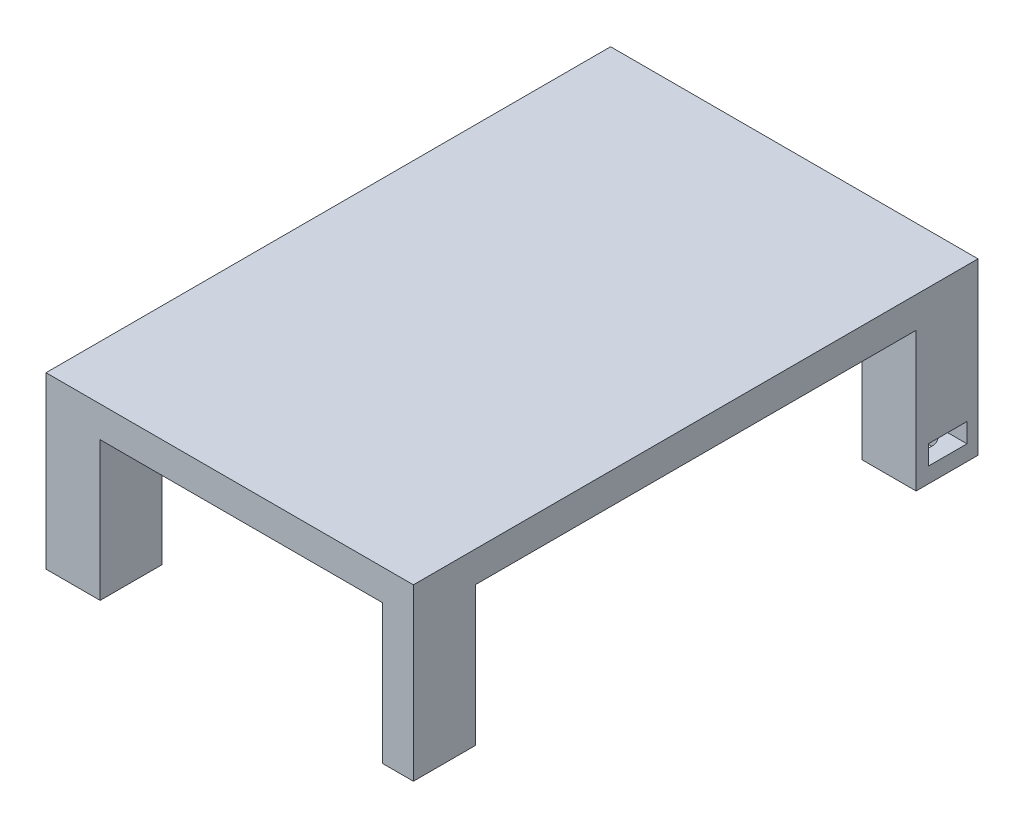
ISO-10303-21;
HEADER;
FILE_DESCRIPTION(('STEP AP214'),'2;1');
FILE_NAME('part.step','',(''),(''),'','','');
FILE_SCHEMA(('AUTOMOTIVE_DESIGN { 1 0 10303 214 1 1 1 1 }'));
ENDSEC;
DATA;
#1=APPLICATION_CONTEXT('core data for automotive mechanical design processes');
#2=APPLICATION_PROTOCOL_DEFINITION('international standard','automotive_design',2000,#1);
#3=PRODUCT_CONTEXT('',#1,'mechanical');
#4=PRODUCT('Part','Part','',(#3));
#5=PRODUCT_RELATED_PRODUCT_CATEGORY('part','',(#4));
#6=PRODUCT_DEFINITION_FORMATION('','',#4);
#7=PRODUCT_DEFINITION_CONTEXT('part definition',#1,'design');
#8=PRODUCT_DEFINITION('design','',#6,#7);
#9=PRODUCT_DEFINITION_SHAPE('','',#8);
#10=(LENGTH_UNIT() NAMED_UNIT(*) SI_UNIT(.MILLI.,.METRE.));
#11=(NAMED_UNIT(*) PLANE_ANGLE_UNIT() SI_UNIT($,.RADIAN.));
#12=(NAMED_UNIT(*) SI_UNIT($,.STERADIAN.) SOLID_ANGLE_UNIT());
#13=UNCERTAINTY_MEASURE_WITH_UNIT(LENGTH_MEASURE(1.E-05),#10,'distance_accuracy_value','');
#14=(GEOMETRIC_REPRESENTATION_CONTEXT(3) GLOBAL_UNCERTAINTY_ASSIGNED_CONTEXT((#13)) GLOBAL_UNIT_ASSIGNED_CONTEXT((#10,
#11,#12)) REPRESENTATION_CONTEXT('',''));
#15=CARTESIAN_POINT('',(0.,0.,0.));
#16=DIRECTION('',(0.,0.,1.));
#17=DIRECTION('',(1.,0.,0.));
#18=AXIS2_PLACEMENT_3D('',#15,#16,#17);
#19=CARTESIAN_POINT('',(-57.3744815271287,22.,-37.3181238209406));
#20=DIRECTION('',(1.,0.,0.));
#21=DIRECTION('',(0.,0.,-1.));
#22=AXIS2_PLACEMENT_3D('',#19,#20,#21);
#23=PLANE('',#22);
#24=DIRECTION('',(0.,0.,1.));
#25=VECTOR('',#24,1.);
#26=CARTESIAN_POINT('',(-57.3744815271287,2.,29.2986266167992));
#27=LINE('',#26,#25);
#28=CARTESIAN_POINT('',(-57.3744815271287,2.,29.2986266167992));
#29=VERTEX_POINT('',#28);
#30=CARTESIAN_POINT('',(-57.3744815271287,2.,34.2986266167992));
#31=VERTEX_POINT('',#30);
#32=EDGE_CURVE('E247',#29,#31,#27,.T.);
#33=ORIENTED_EDGE('',*,*,#32,.F.);
#34=DIRECTION('',(0.,-1.,0.));
#35=VECTOR('',#34,1.);
#36=CARTESIAN_POINT('',(-57.3744815271287,4.5,29.2986266167992));
#37=LINE('',#36,#35);
#38=CARTESIAN_POINT('',(-57.3744815271287,4.5,29.2986266167992));
#39=VERTEX_POINT('',#38);
#40=EDGE_CURVE('E57',#39,#29,#37,.T.);
#41=ORIENTED_EDGE('',*,*,#40,.F.);
#42=DIRECTION('',(0.,0.,1.));
#43=VECTOR('',#42,1.);
#44=CARTESIAN_POINT('',(-57.3744815271287,4.5,29.2986266167992));
#45=LINE('',#44,#43);
#46=CARTESIAN_POINT('',(-57.3744815271287,4.5,34.2986266167992));
#47=VERTEX_POINT('',#46);
#48=EDGE_CURVE('E238',#39,#47,#45,.T.);
#49=ORIENTED_EDGE('',*,*,#48,.T.);
#50=DIRECTION('',(0.,-1.,0.));
#51=VECTOR('',#50,1.);
#52=CARTESIAN_POINT('',(-57.3744815271287,4.5,34.2986266167992));
#53=LINE('',#52,#51);
#54=EDGE_CURVE('E250',#47,#31,#53,.T.);
#55=ORIENTED_EDGE('',*,*,#54,.T.);
#56=EDGE_LOOP('',(#33,#41,#49,#55));
#57=FACE_BOUND('',#56,.T.);
#58=DIRECTION('',(0.,-1.,0.));
#59=VECTOR('',#58,1.);
#60=CARTESIAN_POINT('',(-57.3744815271287,18.,-29.3181238209406));
#61=LINE('',#60,#59);
#62=CARTESIAN_POINT('',(-57.3744815271287,18.,-29.3181238209406));
#63=VERTEX_POINT('',#62);
#64=CARTESIAN_POINT('',(-57.3744815271287,0.,-29.3181238209406));
#65=VERTEX_POINT('',#64);
#66=EDGE_CURVE('E349',#63,#65,#61,.T.);
#67=ORIENTED_EDGE('',*,*,#66,.F.);
#68=DIRECTION('',(0.,0.,1.));
#69=VECTOR('',#68,1.);
#70=CARTESIAN_POINT('',(-57.3744815271287,18.,-29.3181238209406));
#71=LINE('',#70,#69);
#72=CARTESIAN_POINT('',(-57.3744815271287,18.,27.6818761790594));
#73=VERTEX_POINT('',#72);
#74=EDGE_CURVE('E285',#63,#73,#71,.T.);
#75=ORIENTED_EDGE('',*,*,#74,.T.);
#76=DIRECTION('',(0.,-1.,0.));
#77=VECTOR('',#76,1.);
#78=CARTESIAN_POINT('',(-57.3744815271287,18.,27.6818761790594));
#79=LINE('',#78,#77);
#80=CARTESIAN_POINT('',(-57.3744815271287,0.,27.6818761790594));
#81=VERTEX_POINT('',#80);
#82=EDGE_CURVE('E346',#73,#81,#79,.T.);
#83=ORIENTED_EDGE('',*,*,#82,.T.);
#84=DIRECTION('',(0.,0.,1.));
#85=VECTOR('',#84,1.);
#86=CARTESIAN_POINT('',(-57.3744815271287,0.,-37.3181238209406));
#87=LINE('',#86,#85);
#88=CARTESIAN_POINT('',(-57.3744815271287,0.,35.6818761790594));
#89=VERTEX_POINT('',#88);
#90=EDGE_CURVE('E356',#81,#89,#87,.T.);
#91=ORIENTED_EDGE('',*,*,#90,.T.);
#92=DIRECTION('',(0.,-1.,0.));
#93=VECTOR('',#92,1.);
#94=CARTESIAN_POINT('',(-57.3744815271287,22.,35.6818761790594));
#95=LINE('',#94,#93);
#96=CARTESIAN_POINT('',(-57.3744815271287,22.,35.6818761790594));
#97=VERTEX_POINT('',#96);
#98=EDGE_CURVE('E11',#97,#89,#95,.T.);
#99=ORIENTED_EDGE('',*,*,#98,.F.);
#100=DIRECTION('',(0.,0.,1.));
#101=VECTOR('',#100,1.);
#102=CARTESIAN_POINT('',(-57.3744815271287,22.,-37.3181238209406));
#103=LINE('',#102,#101);
#104=CARTESIAN_POINT('',(-57.3744815271287,22.,-37.3181238209406));
#105=VERTEX_POINT('',#104);
#106=EDGE_CURVE('E357',#105,#97,#103,.T.);
#107=ORIENTED_EDGE('',*,*,#106,.F.);
#108=DIRECTION('',(0.,-1.,0.));
#109=VECTOR('',#108,1.);
#110=CARTESIAN_POINT('',(-57.3744815271287,22.,-37.3181238209406));
#111=LINE('',#110,#109);
#112=CARTESIAN_POINT('',(-57.3744815271287,0.,-37.3181238209406));
#113=VERTEX_POINT('',#112);
#114=EDGE_CURVE('E369',#105,#113,#111,.T.);
#115=ORIENTED_EDGE('',*,*,#114,.T.);
#116=EDGE_CURVE('E370',#113,#65,#87,.T.);
#117=ORIENTED_EDGE('',*,*,#116,.T.);
#118=EDGE_LOOP('',(#67,#75,#83,#91,#99,#107,#115,#117));
#119=FACE_BOUND('',#118,.T.);
#120=ADVANCED_FACE('F33',(#57,#119),#23,.F.);
#121=CARTESIAN_POINT('',(-57.3744815271287,22.,35.6818761790594));
#122=DIRECTION('',(0.,0.,-1.));
#123=DIRECTION('',(-1.,0.,0.));
#124=AXIS2_PLACEMENT_3D('',#121,#122,#123);
#125=PLANE('',#124);
#126=DIRECTION('',(0.,-1.,0.));
#127=VECTOR('',#126,1.);
#128=CARTESIAN_POINT('',(-50.3744815271287,18.,35.6818761790594));
#129=LINE('',#128,#127);
#130=CARTESIAN_POINT('',(-50.3744815271287,18.,35.6818761790594));
#131=VERTEX_POINT('',#130);
#132=CARTESIAN_POINT('',(-50.3744815271287,0.,35.6818761790594));
#133=VERTEX_POINT('',#132);
#134=EDGE_CURVE('E342',#131,#133,#129,.T.);
#135=ORIENTED_EDGE('',*,*,#134,.F.);
#136=DIRECTION('',(1.,0.,0.));
#137=VECTOR('',#136,1.);
#138=CARTESIAN_POINT('',(-50.3744815271287,18.,35.6818761790594));
#139=LINE('',#138,#137);
#140=CARTESIAN_POINT('',(-13.8744815271287,18.,35.6818761790594));
#141=VERTEX_POINT('',#140);
#142=EDGE_CURVE('E292',#131,#141,#139,.T.);
#143=ORIENTED_EDGE('',*,*,#142,.T.);
#144=DIRECTION('',(0.,-1.,0.));
#145=VECTOR('',#144,1.);
#146=CARTESIAN_POINT('',(-13.8744815271287,18.,35.6818761790594));
#147=LINE('',#146,#145);
#148=CARTESIAN_POINT('',(-13.8744815271287,0.,35.6818761790594));
#149=VERTEX_POINT('',#148);
#150=EDGE_CURVE('E339',#141,#149,#147,.T.);
#151=ORIENTED_EDGE('',*,*,#150,.T.);
#152=DIRECTION('',(1.,0.,0.));
#153=VECTOR('',#152,1.);
#154=CARTESIAN_POINT('',(-57.3744815271287,0.,35.6818761790594));
#155=LINE('',#154,#153);
#156=CARTESIAN_POINT('',(-9.87448152712869,0.,35.6818761790594));
#157=VERTEX_POINT('',#156);
#158=EDGE_CURVE('E373',#149,#157,#155,.T.);
#159=ORIENTED_EDGE('',*,*,#158,.T.);
#160=DIRECTION('',(0.,-1.,0.));
#161=VECTOR('',#160,1.);
#162=CARTESIAN_POINT('',(-9.87448152712869,22.,35.6818761790594));
#163=LINE('',#162,#161);
#164=CARTESIAN_POINT('',(-9.87448152712869,22.,35.6818761790594));
#165=VERTEX_POINT('',#164);
#166=EDGE_CURVE('E41',#165,#157,#163,.T.);
#167=ORIENTED_EDGE('',*,*,#166,.F.);
#168=DIRECTION('',(1.,0.,0.));
#169=VECTOR('',#168,1.);
#170=CARTESIAN_POINT('',(-57.3744815271287,22.,35.6818761790594));
#171=LINE('',#170,#169);
#172=EDGE_CURVE('E360',#97,#165,#171,.T.);
#173=ORIENTED_EDGE('',*,*,#172,.F.);
#174=ORIENTED_EDGE('',*,*,#98,.T.);
#175=EDGE_CURVE('E374',#89,#133,#155,.T.);
#176=ORIENTED_EDGE('',*,*,#175,.T.);
#177=EDGE_LOOP('',(#135,#143,#151,#159,#167,#173,#174,#176));
#178=FACE_BOUND('',#177,.T.);
#179=ADVANCED_FACE('F418',(#178),#125,.F.);
#180=CARTESIAN_POINT('',(-9.8744815271287,22.,-37.3181238209406));
#181=DIRECTION('',(1.,0.,0.));
#182=DIRECTION('',(0.,0.,-1.));
#183=AXIS2_PLACEMENT_3D('',#180,#181,#182);
#184=PLANE('',#183);
#185=DIRECTION('',(0.,-1.,0.));
#186=VECTOR('',#185,1.);
#187=CARTESIAN_POINT('',(-9.8744815271287,4.5,-30.894669178727));
#188=LINE('',#187,#186);
#189=CARTESIAN_POINT('',(-9.8744815271287,4.5,-30.894669178727));
#190=VERTEX_POINT('',#189);
#191=CARTESIAN_POINT('',(-9.8744815271287,2.,-30.894669178727));
#192=VERTEX_POINT('',#191);
#193=EDGE_CURVE('E49',#190,#192,#188,.T.);
#194=ORIENTED_EDGE('',*,*,#193,.F.);
#195=DIRECTION('',(0.,0.,-1.));
#196=VECTOR('',#195,1.);
#197=CARTESIAN_POINT('',(-9.8744815271287,4.5,-30.894669178727));
#198=LINE('',#197,#196);
#199=CARTESIAN_POINT('',(-9.8744815271287,4.5,-35.894669178727));
#200=VERTEX_POINT('',#199);
#201=EDGE_CURVE('E215',#190,#200,#198,.T.);
#202=ORIENTED_EDGE('',*,*,#201,.T.);
#203=DIRECTION('',(0.,-1.,0.));
#204=VECTOR('',#203,1.);
#205=CARTESIAN_POINT('',(-9.8744815271287,4.5,-35.894669178727));
#206=LINE('',#205,#204);
#207=CARTESIAN_POINT('',(-9.8744815271287,2.,-35.894669178727));
#208=VERTEX_POINT('',#207);
#209=EDGE_CURVE('E218',#200,#208,#206,.T.);
#210=ORIENTED_EDGE('',*,*,#209,.T.);
#211=DIRECTION('',(0.,0.,-1.));
#212=VECTOR('',#211,1.);
#213=CARTESIAN_POINT('',(-9.8744815271287,2.,-30.894669178727));
#214=LINE('',#213,#212);
#215=EDGE_CURVE('E224',#192,#208,#214,.T.);
#216=ORIENTED_EDGE('',*,*,#215,.F.);
#217=EDGE_LOOP('',(#194,#202,#210,#216));
#218=FACE_BOUND('',#217,.T.);
#219=DIRECTION('',(0.,0.,1.));
#220=VECTOR('',#219,1.);
#221=CARTESIAN_POINT('',(-9.8744815271287,0.,-37.3181238209406));
#222=LINE('',#221,#220);
#223=CARTESIAN_POINT('',(-9.87448152712869,0.,27.6818761790594));
#224=VERTEX_POINT('',#223);
#225=EDGE_CURVE('E377',#224,#157,#222,.T.);
#226=ORIENTED_EDGE('',*,*,#225,.F.);
#227=DIRECTION('',(0.,-1.,0.));
#228=VECTOR('',#227,1.);
#229=CARTESIAN_POINT('',(-9.87448152712869,18.,27.6818761790594));
#230=LINE('',#229,#228);
#231=CARTESIAN_POINT('',(-9.87448152712869,18.,27.6818761790594));
#232=VERTEX_POINT('',#231);
#233=EDGE_CURVE('E335',#232,#224,#230,.T.);
#234=ORIENTED_EDGE('',*,*,#233,.F.);
#235=DIRECTION('',(0.,0.,1.));
#236=VECTOR('',#235,1.);
#237=CARTESIAN_POINT('',(-9.8744815271287,18.,-29.3181238209406));
#238=LINE('',#237,#236);
#239=CARTESIAN_POINT('',(-9.8744815271287,18.,-29.3181238209406));
#240=VERTEX_POINT('',#239);
#241=EDGE_CURVE('E299',#240,#232,#238,.T.);
#242=ORIENTED_EDGE('',*,*,#241,.F.);
#243=DIRECTION('',(0.,-1.,0.));
#244=VECTOR('',#243,1.);
#245=CARTESIAN_POINT('',(-9.8744815271287,18.,-29.3181238209406));
#246=LINE('',#245,#244);
#247=CARTESIAN_POINT('',(-9.8744815271287,0.,-29.3181238209406));
#248=VERTEX_POINT('',#247);
#249=EDGE_CURVE('E332',#240,#248,#246,.T.);
#250=ORIENTED_EDGE('',*,*,#249,.T.);
#251=CARTESIAN_POINT('',(-9.8744815271287,0.,-37.3181238209406));
#252=VERTEX_POINT('',#251);
#253=EDGE_CURVE('E378',#252,#248,#222,.T.);
#254=ORIENTED_EDGE('',*,*,#253,.F.);
#255=DIRECTION('',(0.,-1.,0.));
#256=VECTOR('',#255,1.);
#257=CARTESIAN_POINT('',(-9.8744815271287,22.,-37.3181238209406));
#258=LINE('',#257,#256);
#259=CARTESIAN_POINT('',(-9.8744815271287,22.,-37.3181238209406));
#260=VERTEX_POINT('',#259);
#261=EDGE_CURVE('E385',#260,#252,#258,.T.);
#262=ORIENTED_EDGE('',*,*,#261,.F.);
#263=DIRECTION('',(0.,0.,1.));
#264=VECTOR('',#263,1.);
#265=CARTESIAN_POINT('',(-9.8744815271287,22.,-37.3181238209406));
#266=LINE('',#265,#264);
#267=EDGE_CURVE('E363',#260,#165,#266,.T.);
#268=ORIENTED_EDGE('',*,*,#267,.T.);
#269=ORIENTED_EDGE('',*,*,#166,.T.);
#270=EDGE_LOOP('',(#226,#234,#242,#250,#254,#262,#268,#269));
#271=FACE_BOUND('',#270,.T.);
#272=ADVANCED_FACE('F423',(#218,#271),#184,.T.);
#273=CARTESIAN_POINT('',(-57.3744815271287,22.,-37.3181238209406));
#274=DIRECTION('',(0.,0.,-1.));
#275=DIRECTION('',(-1.,0.,0.));
#276=AXIS2_PLACEMENT_3D('',#273,#274,#275);
#277=PLANE('',#276);
#278=DIRECTION('',(-1.,0.,0.));
#279=VECTOR('',#278,1.);
#280=CARTESIAN_POINT('',(-16.8744815271287,18.,-37.3181238209406));
#281=LINE('',#280,#279);
#282=CARTESIAN_POINT('',(-16.8744815271287,18.,-37.3181238209406));
#283=VERTEX_POINT('',#282);
#284=CARTESIAN_POINT('',(-53.3744815271287,18.,-37.3181238209406));
#285=VERTEX_POINT('',#284);
#286=EDGE_CURVE('E277',#283,#285,#281,.T.);
#287=ORIENTED_EDGE('',*,*,#286,.T.);
#288=DIRECTION('',(0.,-1.,0.));
#289=VECTOR('',#288,1.);
#290=CARTESIAN_POINT('',(-53.3744815271287,18.,-37.3181238209406));
#291=LINE('',#290,#289);
#292=CARTESIAN_POINT('',(-53.3744815271287,0.,-37.3181238209406));
#293=VERTEX_POINT('',#292);
#294=EDGE_CURVE('E353',#285,#293,#291,.T.);
#295=ORIENTED_EDGE('',*,*,#294,.T.);
#296=DIRECTION('',(1.,0.,0.));
#297=VECTOR('',#296,1.);
#298=CARTESIAN_POINT('',(-57.3744815271287,0.,-37.3181238209406));
#299=LINE('',#298,#297);
#300=EDGE_CURVE('E361',#113,#293,#299,.T.);
#301=ORIENTED_EDGE('',*,*,#300,.F.);
#302=ORIENTED_EDGE('',*,*,#114,.F.);
#303=DIRECTION('',(1.,0.,0.));
#304=VECTOR('',#303,1.);
#305=CARTESIAN_POINT('',(-57.3744815271287,22.,-37.3181238209406));
#306=LINE('',#305,#304);
#307=EDGE_CURVE('E366',#105,#260,#306,.T.);
#308=ORIENTED_EDGE('',*,*,#307,.T.);
#309=ORIENTED_EDGE('',*,*,#261,.T.);
#310=CARTESIAN_POINT('',(-16.8744815271287,0.,-37.3181238209406));
#311=VERTEX_POINT('',#310);
#312=EDGE_CURVE('E381',#311,#252,#299,.T.);
#313=ORIENTED_EDGE('',*,*,#312,.F.);
#314=DIRECTION('',(0.,-1.,0.));
#315=VECTOR('',#314,1.);
#316=CARTESIAN_POINT('',(-16.8744815271287,18.,-37.3181238209406));
#317=LINE('',#316,#315);
#318=EDGE_CURVE('E306',#283,#311,#317,.T.);
#319=ORIENTED_EDGE('',*,*,#318,.F.);
#320=EDGE_LOOP('',(#287,#295,#301,#302,#308,#309,#313,#319));
#321=FACE_BOUND('',#320,.T.);
#322=ADVANCED_FACE('F442',(#321),#277,.T.);
#323=CARTESIAN_POINT('',(0.,0.,0.));
#324=DIRECTION('',(0.,1.,0.));
#325=DIRECTION('',(0.,0.,1.));
#326=AXIS2_PLACEMENT_3D('',#323,#324,#325);
#327=PLANE('',#326);
#328=DIRECTION('',(0.,0.,1.));
#329=VECTOR('',#328,1.);
#330=CARTESIAN_POINT('',(-53.3744815271287,0.,-37.3181238209406));
#331=LINE('',#330,#329);
#332=CARTESIAN_POINT('',(-53.3744815271287,0.,-29.3181238209406));
#333=VERTEX_POINT('',#332);
#334=EDGE_CURVE('E274',#293,#333,#331,.T.);
#335=ORIENTED_EDGE('',*,*,#334,.T.);
#336=DIRECTION('',(-1.,0.,0.));
#337=VECTOR('',#336,1.);
#338=CARTESIAN_POINT('',(-53.3744815271287,0.,-29.3181238209406));
#339=LINE('',#338,#337);
#340=EDGE_CURVE('E309',#333,#65,#339,.T.);
#341=ORIENTED_EDGE('',*,*,#340,.T.);
#342=ORIENTED_EDGE('',*,*,#116,.F.);
#343=ORIENTED_EDGE('',*,*,#300,.T.);
#344=EDGE_LOOP('',(#335,#341,#342,#343));
#345=FACE_BOUND('',#344,.T.);
#346=ADVANCED_FACE('F436',(#345),#327,.F.);
#347=CARTESIAN_POINT('',(-53.3744815271287,0.,31.6818761790594));
#348=DIRECTION('',(0.,-1.,0.));
#349=DIRECTION('',(0.,0.,-1.));
#350=AXIS2_PLACEMENT_3D('',#347,#348,#349);
#351=CIRCLE('',#350,2.);
#352=CARTESIAN_POINT('',(-53.3744815271287,0.,29.6818761790594));
#353=VERTEX_POINT('',#352);
#354=EDGE_CURVE('E266',#353,#353,#351,.T.);
#355=ORIENTED_EDGE('',*,*,#354,.F.);
#356=EDGE_LOOP('',(#355));
#357=FACE_BOUND('',#356,.T.);
#358=DIRECTION('',(1.,0.,0.));
#359=VECTOR('',#358,1.);
#360=CARTESIAN_POINT('',(-57.3744815271287,0.,27.6818761790594));
#361=LINE('',#360,#359);
#362=CARTESIAN_POINT('',(-50.3744815271287,0.,27.6818761790594));
#363=VERTEX_POINT('',#362);
#364=EDGE_CURVE('E312',#81,#363,#361,.T.);
#365=ORIENTED_EDGE('',*,*,#364,.T.);
#366=DIRECTION('',(0.,0.,1.));
#367=VECTOR('',#366,1.);
#368=CARTESIAN_POINT('',(-50.3744815271287,0.,27.6818761790594));
#369=LINE('',#368,#367);
#370=EDGE_CURVE('E315',#363,#133,#369,.T.);
#371=ORIENTED_EDGE('',*,*,#370,.T.);
#372=ORIENTED_EDGE('',*,*,#175,.F.);
#373=ORIENTED_EDGE('',*,*,#90,.F.);
#374=EDGE_LOOP('',(#365,#371,#372,#373));
#375=FACE_BOUND('',#374,.T.);
#376=ADVANCED_FACE('F463',(#357,#375),#327,.F.);
#377=DIRECTION('',(0.,0.,-1.));
#378=VECTOR('',#377,1.);
#379=CARTESIAN_POINT('',(-13.8744815271287,0.,35.6818761790594));
#380=LINE('',#379,#378);
#381=CARTESIAN_POINT('',(-13.8744815271287,0.,27.6818761790594));
#382=VERTEX_POINT('',#381);
#383=EDGE_CURVE('E318',#149,#382,#380,.T.);
#384=ORIENTED_EDGE('',*,*,#383,.T.);
#385=DIRECTION('',(1.,0.,0.));
#386=VECTOR('',#385,1.);
#387=CARTESIAN_POINT('',(-13.8744815271287,0.,27.6818761790594));
#388=LINE('',#387,#386);
#389=EDGE_CURVE('E321',#382,#224,#388,.T.);
#390=ORIENTED_EDGE('',*,*,#389,.T.);
#391=ORIENTED_EDGE('',*,*,#225,.T.);
#392=ORIENTED_EDGE('',*,*,#158,.F.);
#393=EDGE_LOOP('',(#384,#390,#391,#392));
#394=FACE_BOUND('',#393,.T.);
#395=ADVANCED_FACE('F491',(#394),#327,.F.);
#396=CARTESIAN_POINT('',(-13.8744815271287,0.,-33.3181238209406));
#397=DIRECTION('',(0.,-1.,0.));
#398=DIRECTION('',(0.,0.,-1.));
#399=AXIS2_PLACEMENT_3D('',#396,#397,#398);
#400=CIRCLE('',#399,2.);
#401=CARTESIAN_POINT('',(-13.8744815271287,0.,-35.3181238209406));
#402=VERTEX_POINT('',#401);
#403=EDGE_CURVE('E267',#402,#402,#400,.T.);
#404=ORIENTED_EDGE('',*,*,#403,.F.);
#405=EDGE_LOOP('',(#404));
#406=FACE_BOUND('',#405,.T.);
#407=DIRECTION('',(-1.,0.,0.));
#408=VECTOR('',#407,1.);
#409=CARTESIAN_POINT('',(-9.8744815271287,0.,-29.3181238209406));
#410=LINE('',#409,#408);
#411=CARTESIAN_POINT('',(-16.8744815271287,0.,-29.3181238209406));
#412=VERTEX_POINT('',#411);
#413=EDGE_CURVE('E324',#248,#412,#410,.T.);
#414=ORIENTED_EDGE('',*,*,#413,.T.);
#415=DIRECTION('',(0.,0.,-1.));
#416=VECTOR('',#415,1.);
#417=CARTESIAN_POINT('',(-16.8744815271287,0.,-29.3181238209406));
#418=LINE('',#417,#416);
#419=EDGE_CURVE('E281',#412,#311,#418,.T.);
#420=ORIENTED_EDGE('',*,*,#419,.T.);
#421=ORIENTED_EDGE('',*,*,#312,.T.);
#422=ORIENTED_EDGE('',*,*,#253,.T.);
#423=EDGE_LOOP('',(#414,#420,#421,#422));
#424=FACE_BOUND('',#423,.T.);
#425=ADVANCED_FACE('F476',(#406,#424),#327,.F.);
#426=CARTESIAN_POINT('',(0.,22.,0.));
#427=DIRECTION('',(0.,1.,0.));
#428=DIRECTION('',(0.,0.,1.));
#429=AXIS2_PLACEMENT_3D('',#426,#427,#428);
#430=PLANE('',#429);
#431=ORIENTED_EDGE('',*,*,#106,.T.);
#432=ORIENTED_EDGE('',*,*,#172,.T.);
#433=ORIENTED_EDGE('',*,*,#267,.F.);
#434=ORIENTED_EDGE('',*,*,#307,.F.);
#435=EDGE_LOOP('',(#431,#432,#433,#434));
#436=FACE_BOUND('',#435,.T.);
#437=ADVANCED_FACE('F470',(#436),#430,.T.);
#438=CARTESIAN_POINT('',(-53.3744815271287,18.,-37.3181238209406));
#439=DIRECTION('',(1.,0.,0.));
#440=DIRECTION('',(0.,0.,-1.));
#441=AXIS2_PLACEMENT_3D('',#438,#439,#440);
#442=PLANE('',#441);
#443=ORIENTED_EDGE('',*,*,#334,.F.);
#444=ORIENTED_EDGE('',*,*,#294,.F.);
#445=DIRECTION('',(0.,0.,1.));
#446=VECTOR('',#445,1.);
#447=CARTESIAN_POINT('',(-53.3744815271287,18.,-37.3181238209406));
#448=LINE('',#447,#446);
#449=CARTESIAN_POINT('',(-53.3744815271287,18.,-29.3181238209406));
#450=VERTEX_POINT('',#449);
#451=EDGE_CURVE('E280',#285,#450,#448,.T.);
#452=ORIENTED_EDGE('',*,*,#451,.T.);
#453=DIRECTION('',(0.,-1.,0.));
#454=VECTOR('',#453,1.);
#455=CARTESIAN_POINT('',(-53.3744815271287,18.,-29.3181238209406));
#456=LINE('',#455,#454);
#457=EDGE_CURVE('E351',#450,#333,#456,.T.);
#458=ORIENTED_EDGE('',*,*,#457,.T.);
#459=EDGE_LOOP('',(#443,#444,#452,#458));
#460=FACE_BOUND('',#459,.T.);
#461=ADVANCED_FACE('F440',(#460),#442,.T.);
#462=CARTESIAN_POINT('',(-53.3744815271287,18.,-29.3181238209406));
#463=DIRECTION('',(0.,0.,1.));
#464=DIRECTION('',(1.,0.,0.));
#465=AXIS2_PLACEMENT_3D('',#462,#463,#464);
#466=PLANE('',#465);
#467=ORIENTED_EDGE('',*,*,#340,.F.);
#468=ORIENTED_EDGE('',*,*,#457,.F.);
#469=DIRECTION('',(-1.,0.,0.));
#470=VECTOR('',#469,1.);
#471=CARTESIAN_POINT('',(-53.3744815271287,18.,-29.3181238209406));
#472=LINE('',#471,#470);
#473=EDGE_CURVE('E283',#450,#63,#472,.T.);
#474=ORIENTED_EDGE('',*,*,#473,.T.);
#475=ORIENTED_EDGE('',*,*,#66,.T.);
#476=EDGE_LOOP('',(#467,#468,#474,#475));
#477=FACE_BOUND('',#476,.T.);
#478=ADVANCED_FACE('F432',(#477),#466,.T.);
#479=CARTESIAN_POINT('',(-57.3744815271287,18.,27.6818761790594));
#480=DIRECTION('',(0.,0.,-1.));
#481=DIRECTION('',(-1.,0.,0.));
#482=AXIS2_PLACEMENT_3D('',#479,#480,#481);
#483=PLANE('',#482);
#484=ORIENTED_EDGE('',*,*,#364,.F.);
#485=ORIENTED_EDGE('',*,*,#82,.F.);
#486=DIRECTION('',(1.,0.,0.));
#487=VECTOR('',#486,1.);
#488=CARTESIAN_POINT('',(-57.3744815271287,18.,27.6818761790594));
#489=LINE('',#488,#487);
#490=CARTESIAN_POINT('',(-50.3744815271287,18.,27.6818761790594));
#491=VERTEX_POINT('',#490);
#492=EDGE_CURVE('E288',#73,#491,#489,.T.);
#493=ORIENTED_EDGE('',*,*,#492,.T.);
#494=DIRECTION('',(0.,-1.,0.));
#495=VECTOR('',#494,1.);
#496=CARTESIAN_POINT('',(-50.3744815271287,18.,27.6818761790594));
#497=LINE('',#496,#495);
#498=EDGE_CURVE('E344',#491,#363,#497,.T.);
#499=ORIENTED_EDGE('',*,*,#498,.T.);
#500=EDGE_LOOP('',(#484,#485,#493,#499));
#501=FACE_BOUND('',#500,.T.);
#502=ADVANCED_FACE('F455',(#501),#483,.T.);
#503=CARTESIAN_POINT('',(-50.3744815271287,18.,27.6818761790594));
#504=DIRECTION('',(1.,0.,0.));
#505=DIRECTION('',(0.,0.,-1.));
#506=AXIS2_PLACEMENT_3D('',#503,#504,#505);
#507=PLANE('',#506);
#508=ORIENTED_EDGE('',*,*,#370,.F.);
#509=ORIENTED_EDGE('',*,*,#498,.F.);
#510=DIRECTION('',(0.,0.,1.));
#511=VECTOR('',#510,1.);
#512=CARTESIAN_POINT('',(-50.3744815271287,18.,27.6818761790594));
#513=LINE('',#512,#511);
#514=EDGE_CURVE('E290',#491,#131,#513,.T.);
#515=ORIENTED_EDGE('',*,*,#514,.T.);
#516=ORIENTED_EDGE('',*,*,#134,.T.);
#517=EDGE_LOOP('',(#508,#509,#515,#516));
#518=FACE_BOUND('',#517,.T.);
#519=ADVANCED_FACE('F458',(#518),#507,.T.);
#520=CARTESIAN_POINT('',(-13.8744815271287,18.,35.6818761790594));
#521=DIRECTION('',(-1.,0.,0.));
#522=DIRECTION('',(0.,0.,1.));
#523=AXIS2_PLACEMENT_3D('',#520,#521,#522);
#524=PLANE('',#523);
#525=ORIENTED_EDGE('',*,*,#383,.F.);
#526=ORIENTED_EDGE('',*,*,#150,.F.);
#527=DIRECTION('',(0.,0.,-1.));
#528=VECTOR('',#527,1.);
#529=CARTESIAN_POINT('',(-13.8744815271287,18.,35.6818761790594));
#530=LINE('',#529,#528);
#531=CARTESIAN_POINT('',(-13.8744815271287,18.,27.6818761790594));
#532=VERTEX_POINT('',#531);
#533=EDGE_CURVE('E295',#141,#532,#530,.T.);
#534=ORIENTED_EDGE('',*,*,#533,.T.);
#535=DIRECTION('',(0.,-1.,0.));
#536=VECTOR('',#535,1.);
#537=CARTESIAN_POINT('',(-13.8744815271287,18.,27.6818761790594));
#538=LINE('',#537,#536);
#539=EDGE_CURVE('E337',#532,#382,#538,.T.);
#540=ORIENTED_EDGE('',*,*,#539,.T.);
#541=EDGE_LOOP('',(#525,#526,#534,#540));
#542=FACE_BOUND('',#541,.T.);
#543=ADVANCED_FACE('F494',(#542),#524,.T.);
#544=CARTESIAN_POINT('',(-13.8744815271287,18.,27.6818761790594));
#545=DIRECTION('',(0.,0.,-1.));
#546=DIRECTION('',(-1.,0.,0.));
#547=AXIS2_PLACEMENT_3D('',#544,#545,#546);
#548=PLANE('',#547);
#549=ORIENTED_EDGE('',*,*,#389,.F.);
#550=ORIENTED_EDGE('',*,*,#539,.F.);
#551=DIRECTION('',(1.,0.,0.));
#552=VECTOR('',#551,1.);
#553=CARTESIAN_POINT('',(-13.8744815271287,18.,27.6818761790594));
#554=LINE('',#553,#552);
#555=EDGE_CURVE('E297',#532,#232,#554,.T.);
#556=ORIENTED_EDGE('',*,*,#555,.T.);
#557=ORIENTED_EDGE('',*,*,#233,.T.);
#558=EDGE_LOOP('',(#549,#550,#556,#557));
#559=FACE_BOUND('',#558,.T.);
#560=ADVANCED_FACE('F488',(#559),#548,.T.);
#561=CARTESIAN_POINT('',(-9.8744815271287,18.,-29.3181238209406));
#562=DIRECTION('',(0.,0.,1.));
#563=DIRECTION('',(1.,0.,0.));
#564=AXIS2_PLACEMENT_3D('',#561,#562,#563);
#565=PLANE('',#564);
#566=ORIENTED_EDGE('',*,*,#413,.F.);
#567=ORIENTED_EDGE('',*,*,#249,.F.);
#568=DIRECTION('',(-1.,0.,0.));
#569=VECTOR('',#568,1.);
#570=CARTESIAN_POINT('',(-9.8744815271287,18.,-29.3181238209406));
#571=LINE('',#570,#569);
#572=CARTESIAN_POINT('',(-16.8744815271287,18.,-29.3181238209406));
#573=VERTEX_POINT('',#572);
#574=EDGE_CURVE('E302',#240,#573,#571,.T.);
#575=ORIENTED_EDGE('',*,*,#574,.T.);
#576=DIRECTION('',(0.,-1.,0.));
#577=VECTOR('',#576,1.);
#578=CARTESIAN_POINT('',(-16.8744815271287,18.,-29.3181238209406));
#579=LINE('',#578,#577);
#580=EDGE_CURVE('E330',#573,#412,#579,.T.);
#581=ORIENTED_EDGE('',*,*,#580,.T.);
#582=EDGE_LOOP('',(#566,#567,#575,#581));
#583=FACE_BOUND('',#582,.T.);
#584=ADVANCED_FACE('F482',(#583),#565,.T.);
#585=CARTESIAN_POINT('',(-16.8744815271287,18.,-29.3181238209406));
#586=DIRECTION('',(-1.,0.,0.));
#587=DIRECTION('',(0.,0.,1.));
#588=AXIS2_PLACEMENT_3D('',#585,#586,#587);
#589=PLANE('',#588);
#590=ORIENTED_EDGE('',*,*,#419,.F.);
#591=ORIENTED_EDGE('',*,*,#580,.F.);
#592=DIRECTION('',(0.,0.,-1.));
#593=VECTOR('',#592,1.);
#594=CARTESIAN_POINT('',(-16.8744815271287,18.,-29.3181238209406));
#595=LINE('',#594,#593);
#596=EDGE_CURVE('E304',#573,#283,#595,.T.);
#597=ORIENTED_EDGE('',*,*,#596,.T.);
#598=ORIENTED_EDGE('',*,*,#318,.T.);
#599=EDGE_LOOP('',(#590,#591,#597,#598));
#600=FACE_BOUND('',#599,.T.);
#601=ADVANCED_FACE('F480',(#600),#589,.T.);
#602=CARTESIAN_POINT('',(0.,18.,0.));
#603=DIRECTION('',(0.,1.,0.));
#604=DIRECTION('',(0.,0.,1.));
#605=AXIS2_PLACEMENT_3D('',#602,#603,#604);
#606=PLANE('',#605);
#607=ORIENTED_EDGE('',*,*,#286,.F.);
#608=ORIENTED_EDGE('',*,*,#596,.F.);
#609=ORIENTED_EDGE('',*,*,#574,.F.);
#610=ORIENTED_EDGE('',*,*,#241,.T.);
#611=ORIENTED_EDGE('',*,*,#555,.F.);
#612=ORIENTED_EDGE('',*,*,#533,.F.);
#613=ORIENTED_EDGE('',*,*,#142,.F.);
#614=ORIENTED_EDGE('',*,*,#514,.F.);
#615=ORIENTED_EDGE('',*,*,#492,.F.);
#616=ORIENTED_EDGE('',*,*,#74,.F.);
#617=ORIENTED_EDGE('',*,*,#473,.F.);
#618=ORIENTED_EDGE('',*,*,#451,.F.);
#619=EDGE_LOOP('',(#607,#608,#609,#610,#611,#612,#613,#614,#615,#616,#617,#618));
#620=FACE_BOUND('',#619,.T.);
#621=ADVANCED_FACE('F448',(#620),#606,.F.);
#622=CARTESIAN_POINT('',(-53.3744815271287,18.,31.6818761790594));
#623=DIRECTION('',(0.,-1.,0.));
#624=DIRECTION('',(0.,0.,-1.));
#625=AXIS2_PLACEMENT_3D('',#622,#623,#624);
#626=CYLINDRICAL_SURFACE('',#625,2.);
#627=CARTESIAN_POINT('',(-53.3744815271287,2.,31.6818761790594));
#628=DIRECTION('',(0.,-1.,0.));
#629=DIRECTION('',(0.,0.,-1.));
#630=AXIS2_PLACEMENT_3D('',#627,#628,#629);
#631=CIRCLE('',#630,2.);
#632=CARTESIAN_POINT('',(-53.3744815271287,2.,29.6818761790594));
#633=VERTEX_POINT('',#632);
#634=EDGE_CURVE('E257',#633,#633,#631,.F.);
#635=ORIENTED_EDGE('',*,*,#634,.T.);
#636=EDGE_LOOP('',(#635));
#637=FACE_BOUND('',#636,.T.);
#638=ORIENTED_EDGE('',*,*,#354,.T.);
#639=EDGE_LOOP('',(#638));
#640=FACE_BOUND('',#639,.T.);
#641=ADVANCED_FACE('F416',(#637,#640),#626,.F.);
#642=CARTESIAN_POINT('',(-13.8744815271287,18.,-33.3181238209406));
#643=DIRECTION('',(0.,-1.,0.));
#644=DIRECTION('',(0.,0.,-1.));
#645=AXIS2_PLACEMENT_3D('',#642,#643,#644);
#646=CYLINDRICAL_SURFACE('',#645,2.);
#647=CARTESIAN_POINT('',(-13.8744815271287,2.,-33.3181238209406));
#648=DIRECTION('',(0.,-1.,0.));
#649=DIRECTION('',(0.,0.,-1.));
#650=AXIS2_PLACEMENT_3D('',#647,#648,#649);
#651=CIRCLE('',#650,2.);
#652=CARTESIAN_POINT('',(-13.8744815271287,2.,-35.3181238209406));
#653=VERTEX_POINT('',#652);
#654=EDGE_CURVE('E230',#653,#653,#651,.F.);
#655=ORIENTED_EDGE('',*,*,#654,.T.);
#656=EDGE_LOOP('',(#655));
#657=FACE_BOUND('',#656,.T.);
#658=ORIENTED_EDGE('',*,*,#403,.T.);
#659=EDGE_LOOP('',(#658));
#660=FACE_BOUND('',#659,.T.);
#661=ADVANCED_FACE('F406',(#657,#660),#646,.F.);
#662=CARTESIAN_POINT('',(-50.8744815271287,4.5,29.2986266167992));
#663=DIRECTION('',(0.,-1.,0.));
#664=DIRECTION('',(0.,0.,-1.));
#665=AXIS2_PLACEMENT_3D('',#662,#663,#664);
#666=PLANE('',#665);
#667=ORIENTED_EDGE('',*,*,#48,.F.);
#668=DIRECTION('',(-1.,0.,0.));
#669=VECTOR('',#668,1.);
#670=CARTESIAN_POINT('',(-50.8744815271287,4.5,29.2986266167992));
#671=LINE('',#670,#669);
#672=CARTESIAN_POINT('',(-50.8744815271287,4.5,29.2986266167992));
#673=VERTEX_POINT('',#672);
#674=EDGE_CURVE('E255',#673,#39,#671,.T.);
#675=ORIENTED_EDGE('',*,*,#674,.F.);
#676=DIRECTION('',(0.,0.,1.));
#677=VECTOR('',#676,1.);
#678=CARTESIAN_POINT('',(-50.8744815271287,4.5,29.2986266167992));
#679=LINE('',#678,#677);
#680=CARTESIAN_POINT('',(-50.8744815271287,4.5,34.2986266167992));
#681=VERTEX_POINT('',#680);
#682=EDGE_CURVE('E243',#673,#681,#679,.T.);
#683=ORIENTED_EDGE('',*,*,#682,.T.);
#684=DIRECTION('',(-1.,0.,0.));
#685=VECTOR('',#684,1.);
#686=CARTESIAN_POINT('',(-50.8744815271287,4.5,34.2986266167992));
#687=LINE('',#686,#685);
#688=EDGE_CURVE('E258',#681,#47,#687,.T.);
#689=ORIENTED_EDGE('',*,*,#688,.T.);
#690=EDGE_LOOP('',(#667,#675,#683,#689));
#691=FACE_BOUND('',#690,.T.);
#692=CARTESIAN_POINT('',(-53.3744815271287,4.5,31.6818761790594));
#693=DIRECTION('',(0.,-1.,0.));
#694=DIRECTION('',(0.,0.,-1.));
#695=AXIS2_PLACEMENT_3D('',#692,#693,#694);
#696=CIRCLE('',#695,2.);
#697=CARTESIAN_POINT('',(-53.3744815271287,4.5,29.6818761790594));
#698=VERTEX_POINT('',#697);
#699=EDGE_CURVE('E270',#698,#698,#696,.F.);
#700=ORIENTED_EDGE('',*,*,#699,.T.);
#701=EDGE_LOOP('',(#700));
#702=FACE_BOUND('',#701,.T.);
#703=ADVANCED_FACE('F415',(#691,#702),#666,.T.);
#704=CARTESIAN_POINT('',(-50.8744815271287,2.,29.2986266167992));
#705=DIRECTION('',(0.,-1.,0.));
#706=DIRECTION('',(0.,0.,-1.));
#707=AXIS2_PLACEMENT_3D('',#704,#705,#706);
#708=PLANE('',#707);
#709=ORIENTED_EDGE('',*,*,#32,.T.);
#710=DIRECTION('',(-1.,0.,0.));
#711=VECTOR('',#710,1.);
#712=CARTESIAN_POINT('',(-50.8744815271287,2.,34.2986266167992));
#713=LINE('',#712,#711);
#714=CARTESIAN_POINT('',(-50.8744815271287,2.,34.2986266167992));
#715=VERTEX_POINT('',#714);
#716=EDGE_CURVE('E260',#715,#31,#713,.T.);
#717=ORIENTED_EDGE('',*,*,#716,.F.);
#718=DIRECTION('',(0.,0.,1.));
#719=VECTOR('',#718,1.);
#720=CARTESIAN_POINT('',(-50.8744815271287,2.,29.2986266167992));
#721=LINE('',#720,#719);
#722=CARTESIAN_POINT('',(-50.8744815271287,2.,29.2986266167992));
#723=VERTEX_POINT('',#722);
#724=EDGE_CURVE('E237',#723,#715,#721,.T.);
#725=ORIENTED_EDGE('',*,*,#724,.F.);
#726=DIRECTION('',(-1.,0.,0.));
#727=VECTOR('',#726,1.);
#728=CARTESIAN_POINT('',(-50.8744815271287,2.,29.2986266167992));
#729=LINE('',#728,#727);
#730=EDGE_CURVE('E245',#723,#29,#729,.T.);
#731=ORIENTED_EDGE('',*,*,#730,.T.);
#732=EDGE_LOOP('',(#709,#717,#725,#731));
#733=FACE_BOUND('',#732,.T.);
#734=ORIENTED_EDGE('',*,*,#634,.F.);
#735=EDGE_LOOP('',(#734));
#736=FACE_BOUND('',#735,.T.);
#737=ADVANCED_FACE('F552',(#733,#736),#708,.F.);
#738=CARTESIAN_POINT('',(-50.8744815271287,4.5,29.2986266167992));
#739=DIRECTION('',(0.,0.,-1.));
#740=DIRECTION('',(-1.,0.,0.));
#741=AXIS2_PLACEMENT_3D('',#738,#739,#740);
#742=PLANE('',#741);
#743=ORIENTED_EDGE('',*,*,#40,.T.);
#744=ORIENTED_EDGE('',*,*,#730,.F.);
#745=DIRECTION('',(0.,-1.,0.));
#746=VECTOR('',#745,1.);
#747=CARTESIAN_POINT('',(-50.8744815271287,4.5,29.2986266167992));
#748=LINE('',#747,#746);
#749=EDGE_CURVE('E234',#673,#723,#748,.T.);
#750=ORIENTED_EDGE('',*,*,#749,.F.);
#751=ORIENTED_EDGE('',*,*,#674,.T.);
#752=EDGE_LOOP('',(#743,#744,#750,#751));
#753=FACE_BOUND('',#752,.T.);
#754=ADVANCED_FACE('F556',(#753),#742,.F.);
#755=CARTESIAN_POINT('',(-50.8744815271287,4.5,34.2986266167992));
#756=DIRECTION('',(0.,0.,-1.));
#757=DIRECTION('',(-1.,0.,0.));
#758=AXIS2_PLACEMENT_3D('',#755,#756,#757);
#759=PLANE('',#758);
#760=ORIENTED_EDGE('',*,*,#54,.F.);
#761=ORIENTED_EDGE('',*,*,#688,.F.);
#762=DIRECTION('',(0.,-1.,0.));
#763=VECTOR('',#762,1.);
#764=CARTESIAN_POINT('',(-50.8744815271287,4.5,34.2986266167992));
#765=LINE('',#764,#763);
#766=EDGE_CURVE('E241',#681,#715,#765,.T.);
#767=ORIENTED_EDGE('',*,*,#766,.T.);
#768=ORIENTED_EDGE('',*,*,#716,.T.);
#769=EDGE_LOOP('',(#760,#761,#767,#768));
#770=FACE_BOUND('',#769,.T.);
#771=ADVANCED_FACE('F548',(#770),#759,.T.);
#772=CARTESIAN_POINT('',(-50.8744815271287,0.,0.));
#773=DIRECTION('',(-1.,0.,0.));
#774=DIRECTION('',(0.,0.,1.));
#775=AXIS2_PLACEMENT_3D('',#772,#773,#774);
#776=PLANE('',#775);
#777=ORIENTED_EDGE('',*,*,#749,.T.);
#778=ORIENTED_EDGE('',*,*,#724,.T.);
#779=ORIENTED_EDGE('',*,*,#766,.F.);
#780=ORIENTED_EDGE('',*,*,#682,.F.);
#781=EDGE_LOOP('',(#777,#778,#779,#780));
#782=FACE_BOUND('',#781,.T.);
#783=ADVANCED_FACE('F545',(#782),#776,.T.);
#784=CARTESIAN_POINT('',(-53.3744815271287,18.,31.6818761790594));
#785=DIRECTION('',(0.,-1.,0.));
#786=DIRECTION('',(0.,0.,-1.));
#787=AXIS2_PLACEMENT_3D('',#784,#785,#786);
#788=PLANE('',#787);
#789=CARTESIAN_POINT('',(-53.3744815271287,18.,31.6818761790594));
#790=DIRECTION('',(0.,-1.,0.));
#791=DIRECTION('',(0.,0.,-1.));
#792=AXIS2_PLACEMENT_3D('',#789,#790,#791);
#793=CIRCLE('',#792,2.);
#794=CARTESIAN_POINT('',(-53.3744815271287,18.,29.6818761790594));
#795=VERTEX_POINT('',#794);
#796=EDGE_CURVE('E271',#795,#795,#793,.T.);
#797=ORIENTED_EDGE('',*,*,#796,.T.);
#798=EDGE_LOOP('',(#797));
#799=FACE_BOUND('',#798,.T.);
#800=ADVANCED_FACE('F536',(#799),#788,.T.);
#801=ORIENTED_EDGE('',*,*,#796,.F.);
#802=EDGE_LOOP('',(#801));
#803=FACE_BOUND('',#802,.T.);
#804=ORIENTED_EDGE('',*,*,#699,.F.);
#805=EDGE_LOOP('',(#804));
#806=FACE_BOUND('',#805,.T.);
#807=ADVANCED_FACE('F529',(#803,#806),#626,.F.);
#808=CARTESIAN_POINT('',(-16.3744815271287,4.5,-30.894669178727));
#809=DIRECTION('',(0.,-1.,0.));
#810=DIRECTION('',(0.,0.,-1.));
#811=AXIS2_PLACEMENT_3D('',#808,#809,#810);
#812=PLANE('',#811);
#813=ORIENTED_EDGE('',*,*,#201,.F.);
#814=DIRECTION('',(1.,0.,0.));
#815=VECTOR('',#814,1.);
#816=CARTESIAN_POINT('',(-16.3744815271287,4.5,-30.894669178727));
#817=LINE('',#816,#815);
#818=CARTESIAN_POINT('',(-16.3744815271287,4.5,-30.894669178727));
#819=VERTEX_POINT('',#818);
#820=EDGE_CURVE('E228',#819,#190,#817,.T.);
#821=ORIENTED_EDGE('',*,*,#820,.F.);
#822=DIRECTION('',(0.,0.,-1.));
#823=VECTOR('',#822,1.);
#824=CARTESIAN_POINT('',(-16.3744815271287,4.5,-30.894669178727));
#825=LINE('',#824,#823);
#826=CARTESIAN_POINT('',(-16.3744815271287,4.5,-35.894669178727));
#827=VERTEX_POINT('',#826);
#828=EDGE_CURVE('E202',#819,#827,#825,.T.);
#829=ORIENTED_EDGE('',*,*,#828,.T.);
#830=DIRECTION('',(1.,0.,0.));
#831=VECTOR('',#830,1.);
#832=CARTESIAN_POINT('',(-16.3744815271287,4.5,-35.894669178727));
#833=LINE('',#832,#831);
#834=EDGE_CURVE('E231',#827,#200,#833,.T.);
#835=ORIENTED_EDGE('',*,*,#834,.T.);
#836=EDGE_LOOP('',(#813,#821,#829,#835));
#837=FACE_BOUND('',#836,.T.);
#838=CARTESIAN_POINT('',(-13.8744815271287,4.5,-33.3181238209406));
#839=DIRECTION('',(0.,-1.,0.));
#840=DIRECTION('',(0.,0.,-1.));
#841=AXIS2_PLACEMENT_3D('',#838,#839,#840);
#842=CIRCLE('',#841,2.);
#843=CARTESIAN_POINT('',(-13.8744815271287,4.5,-35.3181238209406));
#844=VERTEX_POINT('',#843);
#845=EDGE_CURVE('E36',#844,#844,#842,.F.);
#846=ORIENTED_EDGE('',*,*,#845,.T.);
#847=EDGE_LOOP('',(#846));
#848=FACE_BOUND('',#847,.T.);
#849=ADVANCED_FACE('F399',(#837,#848),#812,.T.);
#850=CARTESIAN_POINT('',(-16.3744815271287,2.,-30.894669178727));
#851=DIRECTION('',(0.,-1.,0.));
#852=DIRECTION('',(0.,0.,-1.));
#853=AXIS2_PLACEMENT_3D('',#850,#851,#852);
#854=PLANE('',#853);
#855=ORIENTED_EDGE('',*,*,#215,.T.);
#856=DIRECTION('',(1.,0.,0.));
#857=VECTOR('',#856,1.);
#858=CARTESIAN_POINT('',(-16.3744815271287,2.,-35.894669178727));
#859=LINE('',#858,#857);
#860=CARTESIAN_POINT('',(-16.3744815271287,2.,-35.894669178727));
#861=VERTEX_POINT('',#860);
#862=EDGE_CURVE('E201',#861,#208,#859,.T.);
#863=ORIENTED_EDGE('',*,*,#862,.F.);
#864=DIRECTION('',(0.,0.,-1.));
#865=VECTOR('',#864,1.);
#866=CARTESIAN_POINT('',(-16.3744815271287,2.,-30.894669178727));
#867=LINE('',#866,#865);
#868=CARTESIAN_POINT('',(-16.3744815271287,2.,-30.894669178727));
#869=VERTEX_POINT('',#868);
#870=EDGE_CURVE('E206',#869,#861,#867,.T.);
#871=ORIENTED_EDGE('',*,*,#870,.F.);
#872=DIRECTION('',(1.,0.,0.));
#873=VECTOR('',#872,1.);
#874=CARTESIAN_POINT('',(-16.3744815271287,2.,-30.894669178727));
#875=LINE('',#874,#873);
#876=EDGE_CURVE('E193',#869,#192,#875,.T.);
#877=ORIENTED_EDGE('',*,*,#876,.T.);
#878=EDGE_LOOP('',(#855,#863,#871,#877));
#879=FACE_BOUND('',#878,.T.);
#880=ORIENTED_EDGE('',*,*,#654,.F.);
#881=EDGE_LOOP('',(#880));
#882=FACE_BOUND('',#881,.T.);
#883=ADVANCED_FACE('F207',(#879,#882),#854,.F.);
#884=CARTESIAN_POINT('',(-16.3744815271287,4.5,-30.894669178727));
#885=DIRECTION('',(0.,0.,1.));
#886=DIRECTION('',(1.,0.,0.));
#887=AXIS2_PLACEMENT_3D('',#884,#885,#886);
#888=PLANE('',#887);
#889=ORIENTED_EDGE('',*,*,#193,.T.);
#890=ORIENTED_EDGE('',*,*,#876,.F.);
#891=DIRECTION('',(0.,-1.,0.));
#892=VECTOR('',#891,1.);
#893=CARTESIAN_POINT('',(-16.3744815271287,4.5,-30.894669178727));
#894=LINE('',#893,#892);
#895=EDGE_CURVE('E197',#819,#869,#894,.T.);
#896=ORIENTED_EDGE('',*,*,#895,.F.);
#897=ORIENTED_EDGE('',*,*,#820,.T.);
#898=EDGE_LOOP('',(#889,#890,#896,#897));
#899=FACE_BOUND('',#898,.T.);
#900=ADVANCED_FACE('F195',(#899),#888,.F.);
#901=CARTESIAN_POINT('',(-16.3744815271287,4.5,-35.894669178727));
#902=DIRECTION('',(0.,0.,1.));
#903=DIRECTION('',(1.,0.,0.));
#904=AXIS2_PLACEMENT_3D('',#901,#902,#903);
#905=PLANE('',#904);
#906=ORIENTED_EDGE('',*,*,#209,.F.);
#907=ORIENTED_EDGE('',*,*,#834,.F.);
#908=DIRECTION('',(0.,-1.,0.));
#909=VECTOR('',#908,1.);
#910=CARTESIAN_POINT('',(-16.3744815271287,4.5,-35.894669178727));
#911=LINE('',#910,#909);
#912=EDGE_CURVE('E211',#827,#861,#911,.T.);
#913=ORIENTED_EDGE('',*,*,#912,.T.);
#914=ORIENTED_EDGE('',*,*,#862,.T.);
#915=EDGE_LOOP('',(#906,#907,#913,#914));
#916=FACE_BOUND('',#915,.T.);
#917=ADVANCED_FACE('F526',(#916),#905,.T.);
#918=CARTESIAN_POINT('',(-16.3744815271287,0.,0.));
#919=DIRECTION('',(1.,0.,0.));
#920=DIRECTION('',(0.,0.,-1.));
#921=AXIS2_PLACEMENT_3D('',#918,#919,#920);
#922=PLANE('',#921);
#923=ORIENTED_EDGE('',*,*,#895,.T.);
#924=ORIENTED_EDGE('',*,*,#870,.T.);
#925=ORIENTED_EDGE('',*,*,#912,.F.);
#926=ORIENTED_EDGE('',*,*,#828,.F.);
#927=EDGE_LOOP('',(#923,#924,#925,#926));
#928=FACE_BOUND('',#927,.T.);
#929=ADVANCED_FACE('F214',(#928),#922,.T.);
#930=CARTESIAN_POINT('',(-13.8744815271287,18.,-33.3181238209406));
#931=DIRECTION('',(0.,-1.,0.));
#932=DIRECTION('',(0.,0.,-1.));
#933=AXIS2_PLACEMENT_3D('',#930,#931,#932);
#934=PLANE('',#933);
#935=CARTESIAN_POINT('',(-13.8744815271287,18.,-33.3181238209406));
#936=DIRECTION('',(0.,-1.,0.));
#937=DIRECTION('',(0.,0.,-1.));
#938=AXIS2_PLACEMENT_3D('',#935,#936,#937);
#939=CIRCLE('',#938,2.);
#940=CARTESIAN_POINT('',(-13.8744815271287,18.,-35.3181238209406));
#941=VERTEX_POINT('',#940);
#942=EDGE_CURVE('E263',#941,#941,#939,.T.);
#943=ORIENTED_EDGE('',*,*,#942,.T.);
#944=EDGE_LOOP('',(#943));
#945=FACE_BOUND('',#944,.T.);
#946=ADVANCED_FACE('F403',(#945),#934,.T.);
#947=ORIENTED_EDGE('',*,*,#942,.F.);
#948=EDGE_LOOP('',(#947));
#949=FACE_BOUND('',#948,.T.);
#950=ORIENTED_EDGE('',*,*,#845,.F.);
#951=EDGE_LOOP('',(#950));
#952=FACE_BOUND('',#951,.T.);
#953=ADVANCED_FACE('F401',(#949,#952),#646,.F.);
#954=CLOSED_SHELL('',(#120,#179,#272,#322,#346,#376,#395,#425,#437,#461,#478,#502,#519,#543,
#560,#584,#601,#621,#641,#661,#703,#737,#754,#771,#783,#800,#807,#849,#883,#900,#917,#929,#946,#953));
#955=MANIFOLD_SOLID_BREP('B2',#954);
#956=ADVANCED_BREP_SHAPE_REPRESENTATION('',(#18,#955),#14);
#957=SHAPE_DEFINITION_REPRESENTATION(#9,#956);
ENDSEC;
END-ISO-10303-21;
